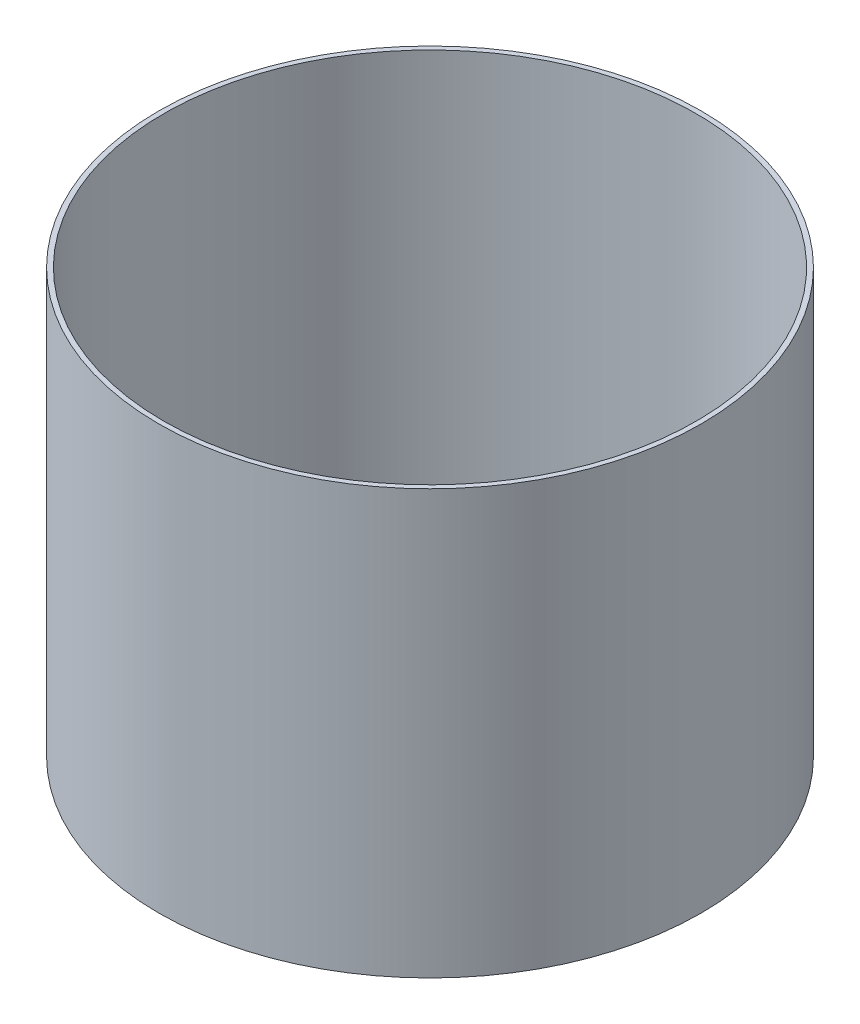
ISO-10303-21;
HEADER;
FILE_DESCRIPTION(('STEP AP214'),'2;1');
FILE_NAME('part.step','',(''),(''),'','','');
FILE_SCHEMA(('AUTOMOTIVE_DESIGN { 1 0 10303 214 1 1 1 1 }'));
ENDSEC;
DATA;
#1=APPLICATION_CONTEXT('core data for automotive mechanical design processes');
#2=APPLICATION_PROTOCOL_DEFINITION('international standard','automotive_design',2000,#1);
#3=PRODUCT_CONTEXT('',#1,'mechanical');
#4=PRODUCT('Part','Part','',(#3));
#5=PRODUCT_RELATED_PRODUCT_CATEGORY('part','',(#4));
#6=PRODUCT_DEFINITION_FORMATION('','',#4);
#7=PRODUCT_DEFINITION_CONTEXT('part definition',#1,'design');
#8=PRODUCT_DEFINITION('design','',#6,#7);
#9=PRODUCT_DEFINITION_SHAPE('','',#8);
#10=(LENGTH_UNIT() NAMED_UNIT(*) SI_UNIT(.MILLI.,.METRE.));
#11=(NAMED_UNIT(*) PLANE_ANGLE_UNIT() SI_UNIT($,.RADIAN.));
#12=(NAMED_UNIT(*) SI_UNIT($,.STERADIAN.) SOLID_ANGLE_UNIT());
#13=UNCERTAINTY_MEASURE_WITH_UNIT(LENGTH_MEASURE(1.E-05),#10,'distance_accuracy_value','');
#14=(GEOMETRIC_REPRESENTATION_CONTEXT(3) GLOBAL_UNCERTAINTY_ASSIGNED_CONTEXT((#13)) GLOBAL_UNIT_ASSIGNED_CONTEXT((#10,
#11,#12)) REPRESENTATION_CONTEXT('',''));
#15=CARTESIAN_POINT('',(0.,0.,0.));
#16=DIRECTION('',(0.,0.,1.));
#17=DIRECTION('',(1.,0.,0.));
#18=AXIS2_PLACEMENT_3D('',#15,#16,#17);
#19=CARTESIAN_POINT('',(0.,-111.125,0.));
#20=DIRECTION('',(0.,1.,0.));
#21=DIRECTION('',(0.,0.,1.));
#22=AXIS2_PLACEMENT_3D('',#19,#20,#21);
#23=CYLINDRICAL_SURFACE('',#22,71.12);
#24=CARTESIAN_POINT('',(0.,-111.125,0.));
#25=DIRECTION('',(0.,1.,0.));
#26=DIRECTION('',(0.,0.,1.));
#27=AXIS2_PLACEMENT_3D('',#24,#25,#26);
#28=CIRCLE('',#27,71.12);
#29=CARTESIAN_POINT('',(0.,-111.125,71.12));
#30=VERTEX_POINT('',#29);
#31=EDGE_CURVE('E10',#30,#30,#28,.T.);
#32=ORIENTED_EDGE('',*,*,#31,.T.);
#33=EDGE_LOOP('',(#32));
#34=FACE_BOUND('',#33,.T.);
#35=CARTESIAN_POINT('',(0.,0.,0.));
#36=DIRECTION('',(0.,1.,0.));
#37=DIRECTION('',(0.,0.,1.));
#38=AXIS2_PLACEMENT_3D('',#35,#36,#37);
#39=CIRCLE('',#38,71.12);
#40=CARTESIAN_POINT('',(0.,0.,71.12));
#41=VERTEX_POINT('',#40);
#42=EDGE_CURVE('E37',#41,#41,#39,.T.);
#43=ORIENTED_EDGE('',*,*,#42,.F.);
#44=EDGE_LOOP('',(#43));
#45=FACE_BOUND('',#44,.T.);
#46=ADVANCED_FACE('F34',(#34,#45),#23,.T.);
#47=CARTESIAN_POINT('',(0.,-111.125,0.));
#48=DIRECTION('',(0.,1.,0.));
#49=DIRECTION('',(0.,0.,1.));
#50=AXIS2_PLACEMENT_3D('',#47,#48,#49);
#51=PLANE('',#50);
#52=CARTESIAN_POINT('',(0.,-111.125,0.));
#53=DIRECTION('',(0.,1.,0.));
#54=DIRECTION('',(0.,0.,1.));
#55=AXIS2_PLACEMENT_3D('',#52,#53,#54);
#56=CIRCLE('',#55,69.85);
#57=CARTESIAN_POINT('',(0.,-111.125,69.85));
#58=VERTEX_POINT('',#57);
#59=EDGE_CURVE('E44',#58,#58,#56,.T.);
#60=ORIENTED_EDGE('',*,*,#59,.T.);
#61=EDGE_LOOP('',(#60));
#62=FACE_BOUND('',#61,.T.);
#63=ORIENTED_EDGE('',*,*,#31,.F.);
#64=EDGE_LOOP('',(#63));
#65=FACE_BOUND('',#64,.T.);
#66=ADVANCED_FACE('F52',(#62,#65),#51,.F.);
#67=CARTESIAN_POINT('',(0.,0.,0.));
#68=DIRECTION('',(0.,1.,0.));
#69=DIRECTION('',(0.,0.,1.));
#70=AXIS2_PLACEMENT_3D('',#67,#68,#69);
#71=PLANE('',#70);
#72=CARTESIAN_POINT('',(0.,0.,0.));
#73=DIRECTION('',(0.,1.,0.));
#74=DIRECTION('',(0.,0.,1.));
#75=AXIS2_PLACEMENT_3D('',#72,#73,#74);
#76=CIRCLE('',#75,69.85);
#77=CARTESIAN_POINT('',(0.,0.,69.85));
#78=VERTEX_POINT('',#77);
#79=EDGE_CURVE('E46',#78,#78,#76,.T.);
#80=ORIENTED_EDGE('',*,*,#79,.F.);
#81=EDGE_LOOP('',(#80));
#82=FACE_BOUND('',#81,.T.);
#83=ORIENTED_EDGE('',*,*,#42,.T.);
#84=EDGE_LOOP('',(#83));
#85=FACE_BOUND('',#84,.T.);
#86=ADVANCED_FACE('F58',(#82,#85),#71,.T.);
#87=CARTESIAN_POINT('',(0.,-111.125,0.));
#88=DIRECTION('',(0.,1.,0.));
#89=DIRECTION('',(0.,0.,1.));
#90=AXIS2_PLACEMENT_3D('',#87,#88,#89);
#91=CYLINDRICAL_SURFACE('',#90,69.85);
#92=ORIENTED_EDGE('',*,*,#59,.F.);
#93=EDGE_LOOP('',(#92));
#94=FACE_BOUND('',#93,.T.);
#95=ORIENTED_EDGE('',*,*,#79,.T.);
#96=EDGE_LOOP('',(#95));
#97=FACE_BOUND('',#96,.T.);
#98=ADVANCED_FACE('F55',(#94,#97),#91,.F.);
#99=CLOSED_SHELL('',(#46,#66,#86,#98));
#100=MANIFOLD_SOLID_BREP('B2',#99);
#101=ADVANCED_BREP_SHAPE_REPRESENTATION('',(#18,#100),#14);
#102=SHAPE_DEFINITION_REPRESENTATION(#9,#101);
ENDSEC;
END-ISO-10303-21;
